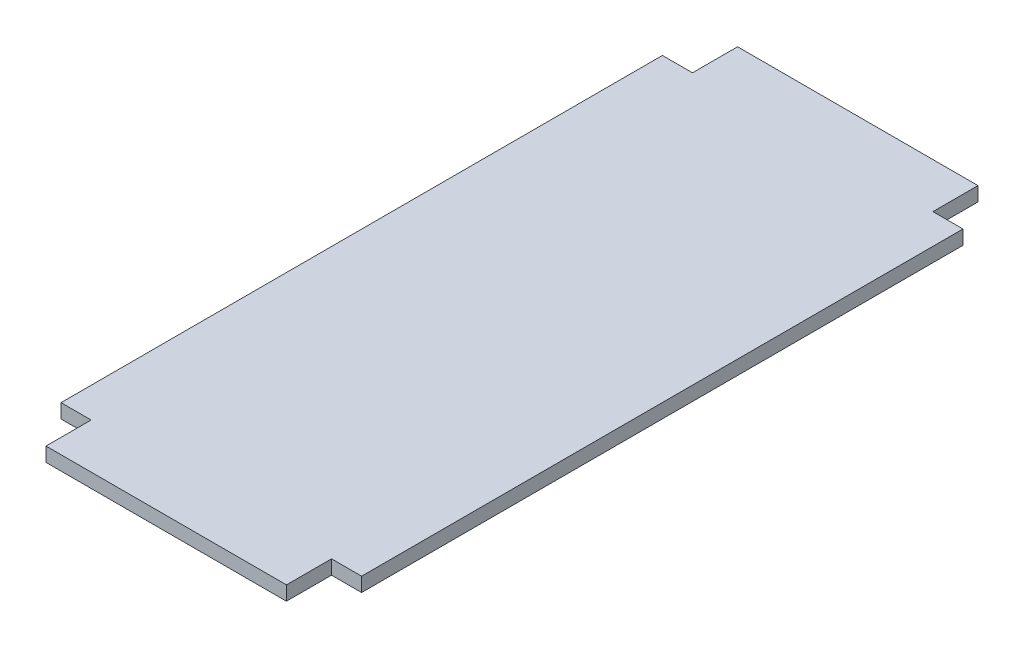
ISO-10303-21;
HEADER;
FILE_DESCRIPTION(('STEP AP214'),'2;1');
FILE_NAME('part.step','',(''),(''),'','','');
FILE_SCHEMA(('AUTOMOTIVE_DESIGN { 1 0 10303 214 1 1 1 1 }'));
ENDSEC;
DATA;
#1=APPLICATION_CONTEXT('core data for automotive mechanical design processes');
#2=APPLICATION_PROTOCOL_DEFINITION('international standard','automotive_design',2000,#1);
#3=PRODUCT_CONTEXT('',#1,'mechanical');
#4=PRODUCT('Part','Part','',(#3));
#5=PRODUCT_RELATED_PRODUCT_CATEGORY('part','',(#4));
#6=PRODUCT_DEFINITION_FORMATION('','',#4);
#7=PRODUCT_DEFINITION_CONTEXT('part definition',#1,'design');
#8=PRODUCT_DEFINITION('design','',#6,#7);
#9=PRODUCT_DEFINITION_SHAPE('','',#8);
#10=(LENGTH_UNIT() NAMED_UNIT(*) SI_UNIT(.MILLI.,.METRE.));
#11=(NAMED_UNIT(*) PLANE_ANGLE_UNIT() SI_UNIT($,.RADIAN.));
#12=(NAMED_UNIT(*) SI_UNIT($,.STERADIAN.) SOLID_ANGLE_UNIT());
#13=UNCERTAINTY_MEASURE_WITH_UNIT(LENGTH_MEASURE(1.E-05),#10,'distance_accuracy_value','');
#14=(GEOMETRIC_REPRESENTATION_CONTEXT(3) GLOBAL_UNCERTAINTY_ASSIGNED_CONTEXT((#13)) GLOBAL_UNIT_ASSIGNED_CONTEXT((#10,
#11,#12)) REPRESENTATION_CONTEXT('',''));
#15=CARTESIAN_POINT('',(0.,0.,0.));
#16=DIRECTION('',(0.,0.,1.));
#17=DIRECTION('',(1.,0.,0.));
#18=AXIS2_PLACEMENT_3D('',#15,#16,#17);
#19=CARTESIAN_POINT('',(25.3873000000001,2.9972,0.));
#20=DIRECTION('',(1.,0.,0.));
#21=DIRECTION('',(0.,0.,-1.));
#22=AXIS2_PLACEMENT_3D('',#19,#20,#21);
#23=PLANE('',#22);
#24=DIRECTION('',(0.,0.,1.));
#25=VECTOR('',#24,1.);
#26=CARTESIAN_POINT('',(25.3873000000001,0.,0.));
#27=LINE('',#26,#25);
#28=CARTESIAN_POINT('',(25.3873000000001,0.,-73.025));
#29=VERTEX_POINT('',#28);
#30=CARTESIAN_POINT('',(25.3873000000001,0.,-63.5));
#31=VERTEX_POINT('',#30);
#32=EDGE_CURVE('E166',#29,#31,#27,.T.);
#33=ORIENTED_EDGE('',*,*,#32,.F.);
#34=DIRECTION('',(0.,-1.,0.));
#35=VECTOR('',#34,1.);
#36=CARTESIAN_POINT('',(25.3873000000001,2.9972,-73.025));
#37=LINE('',#36,#35);
#38=CARTESIAN_POINT('',(25.3873000000001,2.9972,-73.025));
#39=VERTEX_POINT('',#38);
#40=EDGE_CURVE('E11',#39,#29,#37,.T.);
#41=ORIENTED_EDGE('',*,*,#40,.F.);
#42=DIRECTION('',(0.,0.,1.));
#43=VECTOR('',#42,1.);
#44=CARTESIAN_POINT('',(25.3873000000001,2.9972,0.));
#45=LINE('',#44,#43);
#46=CARTESIAN_POINT('',(25.3873000000001,2.9972,-63.5));
#47=VERTEX_POINT('',#46);
#48=EDGE_CURVE('E208',#39,#47,#45,.T.);
#49=ORIENTED_EDGE('',*,*,#48,.T.);
#50=DIRECTION('',(0.,-1.,0.));
#51=VECTOR('',#50,1.);
#52=CARTESIAN_POINT('',(25.3873000000001,2.9972,-63.5));
#53=LINE('',#52,#51);
#54=EDGE_CURVE('E104',#47,#31,#53,.T.);
#55=ORIENTED_EDGE('',*,*,#54,.T.);
#56=EDGE_LOOP('',(#33,#41,#49,#55));
#57=FACE_BOUND('',#56,.T.);
#58=ADVANCED_FACE('F41',(#57),#23,.T.);
#59=CARTESIAN_POINT('',(0.,2.9972,-73.025));
#60=DIRECTION('',(0.,0.,1.));
#61=DIRECTION('',(1.,0.,0.));
#62=AXIS2_PLACEMENT_3D('',#59,#60,#61);
#63=PLANE('',#62);
#64=DIRECTION('',(-1.,0.,0.));
#65=VECTOR('',#64,1.);
#66=CARTESIAN_POINT('',(0.,0.,-73.025));
#67=LINE('',#66,#65);
#68=CARTESIAN_POINT('',(-25.3872999999999,0.,-73.025));
#69=VERTEX_POINT('',#68);
#70=EDGE_CURVE('E170',#29,#69,#67,.T.);
#71=ORIENTED_EDGE('',*,*,#70,.T.);
#72=DIRECTION('',(0.,-1.,0.));
#73=VECTOR('',#72,1.);
#74=CARTESIAN_POINT('',(-25.3872999999999,2.9972,-73.025));
#75=LINE('',#74,#73);
#76=CARTESIAN_POINT('',(-25.3872999999999,2.9972,-73.025));
#77=VERTEX_POINT('',#76);
#78=EDGE_CURVE('E50',#77,#69,#75,.T.);
#79=ORIENTED_EDGE('',*,*,#78,.F.);
#80=DIRECTION('',(-1.,0.,0.));
#81=VECTOR('',#80,1.);
#82=CARTESIAN_POINT('',(0.,2.9972,-73.025));
#83=LINE('',#82,#81);
#84=EDGE_CURVE('E262',#39,#77,#83,.T.);
#85=ORIENTED_EDGE('',*,*,#84,.F.);
#86=ORIENTED_EDGE('',*,*,#40,.T.);
#87=EDGE_LOOP('',(#71,#79,#85,#86));
#88=FACE_BOUND('',#87,.T.);
#89=ADVANCED_FACE('F294',(#88),#63,.F.);
#90=CARTESIAN_POINT('',(-25.3872999999999,2.9972,0.));
#91=DIRECTION('',(1.,0.,0.));
#92=DIRECTION('',(0.,0.,-1.));
#93=AXIS2_PLACEMENT_3D('',#90,#91,#92);
#94=PLANE('',#93);
#95=DIRECTION('',(0.,0.,1.));
#96=VECTOR('',#95,1.);
#97=CARTESIAN_POINT('',(-25.3872999999999,0.,0.));
#98=LINE('',#97,#96);
#99=CARTESIAN_POINT('',(-25.3872999999999,0.,-63.5));
#100=VERTEX_POINT('',#99);
#101=EDGE_CURVE('E173',#69,#100,#98,.T.);
#102=ORIENTED_EDGE('',*,*,#101,.T.);
#103=DIRECTION('',(0.,-1.,0.));
#104=VECTOR('',#103,1.);
#105=CARTESIAN_POINT('',(-25.3872999999999,2.9972,-63.5));
#106=LINE('',#105,#104);
#107=CARTESIAN_POINT('',(-25.3872999999999,2.9972,-63.5));
#108=VERTEX_POINT('',#107);
#109=EDGE_CURVE('E230',#108,#100,#106,.T.);
#110=ORIENTED_EDGE('',*,*,#109,.F.);
#111=DIRECTION('',(0.,0.,1.));
#112=VECTOR('',#111,1.);
#113=CARTESIAN_POINT('',(-25.3872999999999,2.9972,0.));
#114=LINE('',#113,#112);
#115=EDGE_CURVE('E240',#77,#108,#114,.T.);
#116=ORIENTED_EDGE('',*,*,#115,.F.);
#117=ORIENTED_EDGE('',*,*,#78,.T.);
#118=EDGE_LOOP('',(#102,#110,#116,#117));
#119=FACE_BOUND('',#118,.T.);
#120=ADVANCED_FACE('F238',(#119),#94,.F.);
#121=CARTESIAN_POINT('',(0.,2.9972,-63.5));
#122=DIRECTION('',(0.,0.,-1.));
#123=DIRECTION('',(-1.,0.,0.));
#124=AXIS2_PLACEMENT_3D('',#121,#122,#123);
#125=PLANE('',#124);
#126=DIRECTION('',(1.,0.,0.));
#127=VECTOR('',#126,1.);
#128=CARTESIAN_POINT('',(0.,0.,-63.5));
#129=LINE('',#128,#127);
#130=CARTESIAN_POINT('',(-31.7372999999999,0.,-63.5));
#131=VERTEX_POINT('',#130);
#132=EDGE_CURVE('E177',#131,#100,#129,.T.);
#133=ORIENTED_EDGE('',*,*,#132,.F.);
#134=DIRECTION('',(0.,-1.,0.));
#135=VECTOR('',#134,1.);
#136=CARTESIAN_POINT('',(-31.7372999999999,2.9972,-63.5));
#137=LINE('',#136,#135);
#138=CARTESIAN_POINT('',(-31.7372999999999,2.9972,-63.5));
#139=VERTEX_POINT('',#138);
#140=EDGE_CURVE('E227',#139,#131,#137,.T.);
#141=ORIENTED_EDGE('',*,*,#140,.F.);
#142=DIRECTION('',(1.,0.,0.));
#143=VECTOR('',#142,1.);
#144=CARTESIAN_POINT('',(0.,2.9972,-63.5));
#145=LINE('',#144,#143);
#146=EDGE_CURVE('E252',#139,#108,#145,.T.);
#147=ORIENTED_EDGE('',*,*,#146,.T.);
#148=ORIENTED_EDGE('',*,*,#109,.T.);
#149=EDGE_LOOP('',(#133,#141,#147,#148));
#150=FACE_BOUND('',#149,.T.);
#151=ADVANCED_FACE('F249',(#150),#125,.T.);
#152=CARTESIAN_POINT('',(-31.7372999999999,2.9972,0.));
#153=DIRECTION('',(-1.,0.,0.));
#154=DIRECTION('',(0.,0.,1.));
#155=AXIS2_PLACEMENT_3D('',#152,#153,#154);
#156=PLANE('',#155);
#157=DIRECTION('',(0.,0.,-1.));
#158=VECTOR('',#157,1.);
#159=CARTESIAN_POINT('',(-31.7372999999999,0.,0.));
#160=LINE('',#159,#158);
#161=CARTESIAN_POINT('',(-31.7372999999999,0.,63.5));
#162=VERTEX_POINT('',#161);
#163=EDGE_CURVE('E181',#162,#131,#160,.T.);
#164=ORIENTED_EDGE('',*,*,#163,.F.);
#165=DIRECTION('',(0.,-1.,0.));
#166=VECTOR('',#165,1.);
#167=CARTESIAN_POINT('',(-31.7372999999999,2.9972,63.5));
#168=LINE('',#167,#166);
#169=CARTESIAN_POINT('',(-31.7372999999999,2.9972,63.5));
#170=VERTEX_POINT('',#169);
#171=EDGE_CURVE('E224',#170,#162,#168,.T.);
#172=ORIENTED_EDGE('',*,*,#171,.F.);
#173=DIRECTION('',(0.,0.,-1.));
#174=VECTOR('',#173,1.);
#175=CARTESIAN_POINT('',(-31.7372999999999,2.9972,0.));
#176=LINE('',#175,#174);
#177=EDGE_CURVE('E256',#170,#139,#176,.T.);
#178=ORIENTED_EDGE('',*,*,#177,.T.);
#179=ORIENTED_EDGE('',*,*,#140,.T.);
#180=EDGE_LOOP('',(#164,#172,#178,#179));
#181=FACE_BOUND('',#180,.T.);
#182=ADVANCED_FACE('F364',(#181),#156,.T.);
#183=CARTESIAN_POINT('',(0.,2.9972,63.5));
#184=DIRECTION('',(0.,0.,-1.));
#185=DIRECTION('',(-1.,0.,0.));
#186=AXIS2_PLACEMENT_3D('',#183,#184,#185);
#187=PLANE('',#186);
#188=DIRECTION('',(1.,0.,0.));
#189=VECTOR('',#188,1.);
#190=CARTESIAN_POINT('',(0.,0.,63.5));
#191=LINE('',#190,#189);
#192=CARTESIAN_POINT('',(-25.3872999999999,0.,63.5));
#193=VERTEX_POINT('',#192);
#194=EDGE_CURVE('E185',#162,#193,#191,.T.);
#195=ORIENTED_EDGE('',*,*,#194,.T.);
#196=DIRECTION('',(0.,-1.,0.));
#197=VECTOR('',#196,1.);
#198=CARTESIAN_POINT('',(-25.3872999999999,2.9972,63.5));
#199=LINE('',#198,#197);
#200=CARTESIAN_POINT('',(-25.3872999999999,2.9972,63.5));
#201=VERTEX_POINT('',#200);
#202=EDGE_CURVE('E221',#201,#193,#199,.T.);
#203=ORIENTED_EDGE('',*,*,#202,.F.);
#204=DIRECTION('',(1.,0.,0.));
#205=VECTOR('',#204,1.);
#206=CARTESIAN_POINT('',(0.,2.9972,63.5));
#207=LINE('',#206,#205);
#208=EDGE_CURVE('E260',#170,#201,#207,.T.);
#209=ORIENTED_EDGE('',*,*,#208,.F.);
#210=ORIENTED_EDGE('',*,*,#171,.T.);
#211=EDGE_LOOP('',(#195,#203,#209,#210));
#212=FACE_BOUND('',#211,.T.);
#213=ADVANCED_FACE('F355',(#212),#187,.F.);
#214=CARTESIAN_POINT('',(-25.3872999999999,2.9972,0.));
#215=DIRECTION('',(-1.,0.,0.));
#216=DIRECTION('',(0.,0.,1.));
#217=AXIS2_PLACEMENT_3D('',#214,#215,#216);
#218=PLANE('',#217);
#219=DIRECTION('',(0.,0.,-1.));
#220=VECTOR('',#219,1.);
#221=CARTESIAN_POINT('',(-25.3872999999999,0.,0.));
#222=LINE('',#221,#220);
#223=CARTESIAN_POINT('',(-25.3872999999999,0.,73.025));
#224=VERTEX_POINT('',#223);
#225=EDGE_CURVE('E189',#224,#193,#222,.T.);
#226=ORIENTED_EDGE('',*,*,#225,.F.);
#227=DIRECTION('',(0.,-1.,0.));
#228=VECTOR('',#227,1.);
#229=CARTESIAN_POINT('',(-25.3872999999999,2.9972,73.025));
#230=LINE('',#229,#228);
#231=CARTESIAN_POINT('',(-25.3872999999999,2.9972,73.025));
#232=VERTEX_POINT('',#231);
#233=EDGE_CURVE('E218',#232,#224,#230,.T.);
#234=ORIENTED_EDGE('',*,*,#233,.F.);
#235=DIRECTION('',(0.,0.,-1.));
#236=VECTOR('',#235,1.);
#237=CARTESIAN_POINT('',(-25.3872999999999,2.9972,0.));
#238=LINE('',#237,#236);
#239=EDGE_CURVE('E268',#232,#201,#238,.T.);
#240=ORIENTED_EDGE('',*,*,#239,.T.);
#241=ORIENTED_EDGE('',*,*,#202,.T.);
#242=EDGE_LOOP('',(#226,#234,#240,#241));
#243=FACE_BOUND('',#242,.T.);
#244=ADVANCED_FACE('F281',(#243),#218,.T.);
#245=CARTESIAN_POINT('',(0.,2.9972,73.025));
#246=DIRECTION('',(0.,0.,1.));
#247=DIRECTION('',(1.,0.,0.));
#248=AXIS2_PLACEMENT_3D('',#245,#246,#247);
#249=PLANE('',#248);
#250=DIRECTION('',(-1.,0.,0.));
#251=VECTOR('',#250,1.);
#252=CARTESIAN_POINT('',(0.,0.,73.025));
#253=LINE('',#252,#251);
#254=CARTESIAN_POINT('',(25.3873000000001,0.,73.025));
#255=VERTEX_POINT('',#254);
#256=EDGE_CURVE('E193',#255,#224,#253,.T.);
#257=ORIENTED_EDGE('',*,*,#256,.F.);
#258=DIRECTION('',(0.,-1.,0.));
#259=VECTOR('',#258,1.);
#260=CARTESIAN_POINT('',(25.3873000000001,2.9972,73.025));
#261=LINE('',#260,#259);
#262=CARTESIAN_POINT('',(25.3873000000001,2.9972,73.025));
#263=VERTEX_POINT('',#262);
#264=EDGE_CURVE('E215',#263,#255,#261,.T.);
#265=ORIENTED_EDGE('',*,*,#264,.F.);
#266=DIRECTION('',(-1.,0.,0.));
#267=VECTOR('',#266,1.);
#268=CARTESIAN_POINT('',(0.,2.9972,73.025));
#269=LINE('',#268,#267);
#270=EDGE_CURVE('E160',#263,#232,#269,.T.);
#271=ORIENTED_EDGE('',*,*,#270,.T.);
#272=ORIENTED_EDGE('',*,*,#233,.T.);
#273=EDGE_LOOP('',(#257,#265,#271,#272));
#274=FACE_BOUND('',#273,.T.);
#275=ADVANCED_FACE('F275',(#274),#249,.T.);
#276=CARTESIAN_POINT('',(25.3873000000001,2.9972,0.));
#277=DIRECTION('',(-1.,0.,0.));
#278=DIRECTION('',(0.,0.,1.));
#279=AXIS2_PLACEMENT_3D('',#276,#277,#278);
#280=PLANE('',#279);
#281=DIRECTION('',(0.,0.,-1.));
#282=VECTOR('',#281,1.);
#283=CARTESIAN_POINT('',(25.3873000000001,0.,0.));
#284=LINE('',#283,#282);
#285=CARTESIAN_POINT('',(25.3873000000001,0.,63.5));
#286=VERTEX_POINT('',#285);
#287=EDGE_CURVE('E197',#255,#286,#284,.T.);
#288=ORIENTED_EDGE('',*,*,#287,.T.);
#289=DIRECTION('',(0.,-1.,0.));
#290=VECTOR('',#289,1.);
#291=CARTESIAN_POINT('',(25.3873000000001,2.9972,63.5));
#292=LINE('',#291,#290);
#293=CARTESIAN_POINT('',(25.3873000000001,2.9972,63.5));
#294=VERTEX_POINT('',#293);
#295=EDGE_CURVE('E145',#294,#286,#292,.T.);
#296=ORIENTED_EDGE('',*,*,#295,.F.);
#297=DIRECTION('',(0.,0.,-1.));
#298=VECTOR('',#297,1.);
#299=CARTESIAN_POINT('',(25.3873000000001,2.9972,0.));
#300=LINE('',#299,#298);
#301=EDGE_CURVE('E155',#263,#294,#300,.T.);
#302=ORIENTED_EDGE('',*,*,#301,.F.);
#303=ORIENTED_EDGE('',*,*,#264,.T.);
#304=EDGE_LOOP('',(#288,#296,#302,#303));
#305=FACE_BOUND('',#304,.T.);
#306=ADVANCED_FACE('F284',(#305),#280,.F.);
#307=CARTESIAN_POINT('',(0.,2.9972,63.5));
#308=DIRECTION('',(0.,0.,1.));
#309=DIRECTION('',(1.,0.,0.));
#310=AXIS2_PLACEMENT_3D('',#307,#308,#309);
#311=PLANE('',#310);
#312=DIRECTION('',(-1.,0.,0.));
#313=VECTOR('',#312,1.);
#314=CARTESIAN_POINT('',(0.,0.,63.5));
#315=LINE('',#314,#313);
#316=CARTESIAN_POINT('',(31.7373000000001,0.,63.5));
#317=VERTEX_POINT('',#316);
#318=EDGE_CURVE('E143',#317,#286,#315,.T.);
#319=ORIENTED_EDGE('',*,*,#318,.F.);
#320=DIRECTION('',(0.,-1.,0.));
#321=VECTOR('',#320,1.);
#322=CARTESIAN_POINT('',(31.7373000000001,2.9972,63.5));
#323=LINE('',#322,#321);
#324=CARTESIAN_POINT('',(31.7373000000001,2.9972,63.5));
#325=VERTEX_POINT('',#324);
#326=EDGE_CURVE('E137',#325,#317,#323,.T.);
#327=ORIENTED_EDGE('',*,*,#326,.F.);
#328=DIRECTION('',(-1.,0.,0.));
#329=VECTOR('',#328,1.);
#330=CARTESIAN_POINT('',(0.,2.9972,63.5));
#331=LINE('',#330,#329);
#332=EDGE_CURVE('E141',#325,#294,#331,.T.);
#333=ORIENTED_EDGE('',*,*,#332,.T.);
#334=ORIENTED_EDGE('',*,*,#295,.T.);
#335=EDGE_LOOP('',(#319,#327,#333,#334));
#336=FACE_BOUND('',#335,.T.);
#337=ADVANCED_FACE('F139',(#336),#311,.T.);
#338=CARTESIAN_POINT('',(31.7373000000001,2.9972,0.));
#339=DIRECTION('',(-1.,0.,0.));
#340=DIRECTION('',(0.,0.,1.));
#341=AXIS2_PLACEMENT_3D('',#338,#339,#340);
#342=PLANE('',#341);
#343=DIRECTION('',(0.,0.,-1.));
#344=VECTOR('',#343,1.);
#345=CARTESIAN_POINT('',(31.7373000000001,0.,0.));
#346=LINE('',#345,#344);
#347=CARTESIAN_POINT('',(31.7373000000001,0.,-63.5));
#348=VERTEX_POINT('',#347);
#349=EDGE_CURVE('E97',#317,#348,#346,.T.);
#350=ORIENTED_EDGE('',*,*,#349,.T.);
#351=DIRECTION('',(0.,-1.,0.));
#352=VECTOR('',#351,1.);
#353=CARTESIAN_POINT('',(31.7373000000001,2.9972,-63.5));
#354=LINE('',#353,#352);
#355=CARTESIAN_POINT('',(31.7373000000001,2.9972,-63.5));
#356=VERTEX_POINT('',#355);
#357=EDGE_CURVE('E146',#356,#348,#354,.T.);
#358=ORIENTED_EDGE('',*,*,#357,.F.);
#359=DIRECTION('',(0.,0.,-1.));
#360=VECTOR('',#359,1.);
#361=CARTESIAN_POINT('',(31.7373000000001,2.9972,0.));
#362=LINE('',#361,#360);
#363=EDGE_CURVE('E148',#325,#356,#362,.T.);
#364=ORIENTED_EDGE('',*,*,#363,.F.);
#365=ORIENTED_EDGE('',*,*,#326,.T.);
#366=EDGE_LOOP('',(#350,#358,#364,#365));
#367=FACE_BOUND('',#366,.T.);
#368=ADVANCED_FACE('F149',(#367),#342,.F.);
#369=CARTESIAN_POINT('',(0.,2.9972,-63.5));
#370=DIRECTION('',(0.,0.,1.));
#371=DIRECTION('',(1.,0.,0.));
#372=AXIS2_PLACEMENT_3D('',#369,#370,#371);
#373=PLANE('',#372);
#374=DIRECTION('',(-1.,0.,0.));
#375=VECTOR('',#374,1.);
#376=CARTESIAN_POINT('',(0.,0.,-63.5));
#377=LINE('',#376,#375);
#378=EDGE_CURVE('E205',#348,#31,#377,.T.);
#379=ORIENTED_EDGE('',*,*,#378,.T.);
#380=ORIENTED_EDGE('',*,*,#54,.F.);
#381=DIRECTION('',(-1.,0.,0.));
#382=VECTOR('',#381,1.);
#383=CARTESIAN_POINT('',(0.,2.9972,-63.5));
#384=LINE('',#383,#382);
#385=EDGE_CURVE('E58',#356,#47,#384,.T.);
#386=ORIENTED_EDGE('',*,*,#385,.F.);
#387=ORIENTED_EDGE('',*,*,#357,.T.);
#388=EDGE_LOOP('',(#379,#380,#386,#387));
#389=FACE_BOUND('',#388,.T.);
#390=ADVANCED_FACE('F300',(#389),#373,.F.);
#391=CARTESIAN_POINT('',(0.,2.9972,0.));
#392=DIRECTION('',(0.,1.,0.));
#393=DIRECTION('',(0.,0.,1.));
#394=AXIS2_PLACEMENT_3D('',#391,#392,#393);
#395=PLANE('',#394);
#396=ORIENTED_EDGE('',*,*,#48,.F.);
#397=ORIENTED_EDGE('',*,*,#84,.T.);
#398=ORIENTED_EDGE('',*,*,#115,.T.);
#399=ORIENTED_EDGE('',*,*,#146,.F.);
#400=ORIENTED_EDGE('',*,*,#177,.F.);
#401=ORIENTED_EDGE('',*,*,#208,.T.);
#402=ORIENTED_EDGE('',*,*,#239,.F.);
#403=ORIENTED_EDGE('',*,*,#270,.F.);
#404=ORIENTED_EDGE('',*,*,#301,.T.);
#405=ORIENTED_EDGE('',*,*,#332,.F.);
#406=ORIENTED_EDGE('',*,*,#363,.T.);
#407=ORIENTED_EDGE('',*,*,#385,.T.);
#408=EDGE_LOOP('',(#396,#397,#398,#399,#400,#401,#402,#403,#404,#405,#406,#407));
#409=FACE_BOUND('',#408,.T.);
#410=ADVANCED_FACE('F152',(#409),#395,.T.);
#411=CARTESIAN_POINT('',(0.,0.,0.));
#412=DIRECTION('',(0.,1.,0.));
#413=DIRECTION('',(0.,0.,1.));
#414=AXIS2_PLACEMENT_3D('',#411,#412,#413);
#415=PLANE('',#414);
#416=ORIENTED_EDGE('',*,*,#32,.T.);
#417=ORIENTED_EDGE('',*,*,#378,.F.);
#418=ORIENTED_EDGE('',*,*,#349,.F.);
#419=ORIENTED_EDGE('',*,*,#318,.T.);
#420=ORIENTED_EDGE('',*,*,#287,.F.);
#421=ORIENTED_EDGE('',*,*,#256,.T.);
#422=ORIENTED_EDGE('',*,*,#225,.T.);
#423=ORIENTED_EDGE('',*,*,#194,.F.);
#424=ORIENTED_EDGE('',*,*,#163,.T.);
#425=ORIENTED_EDGE('',*,*,#132,.T.);
#426=ORIENTED_EDGE('',*,*,#101,.F.);
#427=ORIENTED_EDGE('',*,*,#70,.F.);
#428=EDGE_LOOP('',(#416,#417,#418,#419,#420,#421,#422,#423,#424,#425,#426,#427));
#429=FACE_BOUND('',#428,.T.);
#430=ADVANCED_FACE('F244',(#429),#415,.F.);
#431=CLOSED_SHELL('',(#58,#89,#120,#151,#182,#213,#244,#275,#306,#337,#368,#390,#410,#430));
#432=MANIFOLD_SOLID_BREP('B2',#431);
#433=ADVANCED_BREP_SHAPE_REPRESENTATION('',(#18,#432),#14);
#434=SHAPE_DEFINITION_REPRESENTATION(#9,#433);
ENDSEC;
END-ISO-10303-21;
